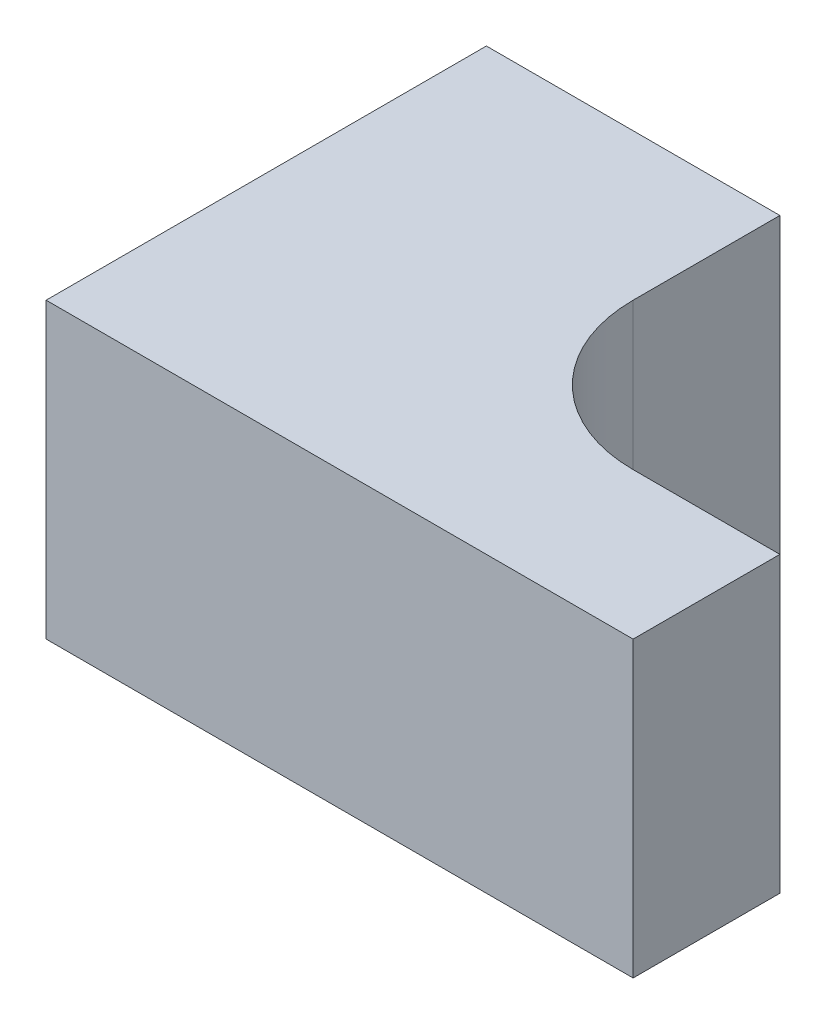
ISO-10303-21;
HEADER;
FILE_DESCRIPTION(('STEP AP214'),'2;1');
FILE_NAME('part.step','',(''),(''),'','','');
FILE_SCHEMA(('AUTOMOTIVE_DESIGN { 1 0 10303 214 1 1 1 1 }'));
ENDSEC;
DATA;
#1=APPLICATION_CONTEXT('core data for automotive mechanical design processes');
#2=APPLICATION_PROTOCOL_DEFINITION('international standard','automotive_design',2000,#1);
#3=PRODUCT_CONTEXT('',#1,'mechanical');
#4=PRODUCT('Part','Part','',(#3));
#5=PRODUCT_RELATED_PRODUCT_CATEGORY('part','',(#4));
#6=PRODUCT_DEFINITION_FORMATION('','',#4);
#7=PRODUCT_DEFINITION_CONTEXT('part definition',#1,'design');
#8=PRODUCT_DEFINITION('design','',#6,#7);
#9=PRODUCT_DEFINITION_SHAPE('','',#8);
#10=(LENGTH_UNIT() NAMED_UNIT(*) SI_UNIT(.MILLI.,.METRE.));
#11=(NAMED_UNIT(*) PLANE_ANGLE_UNIT() SI_UNIT($,.RADIAN.));
#12=(NAMED_UNIT(*) SI_UNIT($,.STERADIAN.) SOLID_ANGLE_UNIT());
#13=UNCERTAINTY_MEASURE_WITH_UNIT(LENGTH_MEASURE(1.E-05),#10,'distance_accuracy_value','');
#14=(GEOMETRIC_REPRESENTATION_CONTEXT(3) GLOBAL_UNCERTAINTY_ASSIGNED_CONTEXT((#13)) GLOBAL_UNIT_ASSIGNED_CONTEXT((#10,
#11,#12)) REPRESENTATION_CONTEXT('',''));
#15=CARTESIAN_POINT('',(0.,0.,0.));
#16=DIRECTION('',(0.,0.,1.));
#17=DIRECTION('',(1.,0.,0.));
#18=AXIS2_PLACEMENT_3D('',#15,#16,#17);
#19=CARTESIAN_POINT('',(-20.,20.,0.));
#20=DIRECTION('',(0.,0.,1.));
#21=DIRECTION('',(1.,0.,0.));
#22=AXIS2_PLACEMENT_3D('',#19,#20,#21);
#23=PLANE('',#22);
#24=DIRECTION('',(-1.,0.,0.));
#25=VECTOR('',#24,1.);
#26=CARTESIAN_POINT('',(-20.,0.,0.));
#27=LINE('',#26,#25);
#28=CARTESIAN_POINT('',(0.,0.,0.));
#29=VERTEX_POINT('',#28);
#30=CARTESIAN_POINT('',(-20.,0.,0.));
#31=VERTEX_POINT('',#30);
#32=EDGE_CURVE('E134',#29,#31,#27,.T.);
#33=ORIENTED_EDGE('',*,*,#32,.T.);
#34=DIRECTION('',(0.,-1.,0.));
#35=VECTOR('',#34,1.);
#36=CARTESIAN_POINT('',(-20.,20.,0.));
#37=LINE('',#36,#35);
#38=CARTESIAN_POINT('',(-20.,20.,0.));
#39=VERTEX_POINT('',#38);
#40=EDGE_CURVE('E11',#39,#31,#37,.T.);
#41=ORIENTED_EDGE('',*,*,#40,.F.);
#42=DIRECTION('',(-1.,0.,0.));
#43=VECTOR('',#42,1.);
#44=CARTESIAN_POINT('',(-20.,20.,0.));
#45=LINE('',#44,#43);
#46=CARTESIAN_POINT('',(0.,20.,0.));
#47=VERTEX_POINT('',#46);
#48=EDGE_CURVE('E153',#47,#39,#45,.T.);
#49=ORIENTED_EDGE('',*,*,#48,.F.);
#50=DIRECTION('',(0.,-1.,0.));
#51=VECTOR('',#50,1.);
#52=CARTESIAN_POINT('',(0.,20.,0.));
#53=LINE('',#52,#51);
#54=EDGE_CURVE('E130',#47,#29,#53,.T.);
#55=ORIENTED_EDGE('',*,*,#54,.T.);
#56=EDGE_LOOP('',(#33,#41,#49,#55));
#57=FACE_BOUND('',#56,.T.);
#58=ADVANCED_FACE('F39',(#57),#23,.F.);
#59=CARTESIAN_POINT('',(-20.,20.,30.));
#60=DIRECTION('',(1.,0.,0.));
#61=DIRECTION('',(0.,0.,-1.));
#62=AXIS2_PLACEMENT_3D('',#59,#60,#61);
#63=PLANE('',#62);
#64=DIRECTION('',(0.,0.,1.));
#65=VECTOR('',#64,1.);
#66=CARTESIAN_POINT('',(-20.,0.,30.));
#67=LINE('',#66,#65);
#68=CARTESIAN_POINT('',(-20.,0.,30.));
#69=VERTEX_POINT('',#68);
#70=EDGE_CURVE('E138',#31,#69,#67,.T.);
#71=ORIENTED_EDGE('',*,*,#70,.T.);
#72=DIRECTION('',(0.,-1.,0.));
#73=VECTOR('',#72,1.);
#74=CARTESIAN_POINT('',(-20.,20.,30.));
#75=LINE('',#74,#73);
#76=CARTESIAN_POINT('',(-20.,20.,30.));
#77=VERTEX_POINT('',#76);
#78=EDGE_CURVE('E48',#77,#69,#75,.T.);
#79=ORIENTED_EDGE('',*,*,#78,.F.);
#80=DIRECTION('',(0.,0.,1.));
#81=VECTOR('',#80,1.);
#82=CARTESIAN_POINT('',(-20.,20.,30.));
#83=LINE('',#82,#81);
#84=EDGE_CURVE('E96',#39,#77,#83,.T.);
#85=ORIENTED_EDGE('',*,*,#84,.F.);
#86=ORIENTED_EDGE('',*,*,#40,.T.);
#87=EDGE_LOOP('',(#71,#79,#85,#86));
#88=FACE_BOUND('',#87,.T.);
#89=ADVANCED_FACE('F187',(#88),#63,.F.);
#90=CARTESIAN_POINT('',(20.,20.,30.));
#91=DIRECTION('',(0.,0.,-1.));
#92=DIRECTION('',(-1.,0.,0.));
#93=AXIS2_PLACEMENT_3D('',#90,#91,#92);
#94=PLANE('',#93);
#95=DIRECTION('',(1.,0.,0.));
#96=VECTOR('',#95,1.);
#97=CARTESIAN_POINT('',(20.,0.,30.));
#98=LINE('',#97,#96);
#99=CARTESIAN_POINT('',(20.,0.,30.));
#100=VERTEX_POINT('',#99);
#101=EDGE_CURVE('E141',#69,#100,#98,.T.);
#102=ORIENTED_EDGE('',*,*,#101,.T.);
#103=DIRECTION('',(0.,-1.,0.));
#104=VECTOR('',#103,1.);
#105=CARTESIAN_POINT('',(20.,20.,30.));
#106=LINE('',#105,#104);
#107=CARTESIAN_POINT('',(20.,20.,30.));
#108=VERTEX_POINT('',#107);
#109=EDGE_CURVE('E160',#108,#100,#106,.T.);
#110=ORIENTED_EDGE('',*,*,#109,.F.);
#111=DIRECTION('',(1.,0.,0.));
#112=VECTOR('',#111,1.);
#113=CARTESIAN_POINT('',(20.,20.,30.));
#114=LINE('',#113,#112);
#115=EDGE_CURVE('E170',#77,#108,#114,.T.);
#116=ORIENTED_EDGE('',*,*,#115,.F.);
#117=ORIENTED_EDGE('',*,*,#78,.T.);
#118=EDGE_LOOP('',(#102,#110,#116,#117));
#119=FACE_BOUND('',#118,.T.);
#120=ADVANCED_FACE('F168',(#119),#94,.F.);
#121=CARTESIAN_POINT('',(20.,20.,20.));
#122=DIRECTION('',(-1.,0.,0.));
#123=DIRECTION('',(0.,0.,1.));
#124=AXIS2_PLACEMENT_3D('',#121,#122,#123);
#125=PLANE('',#124);
#126=DIRECTION('',(0.,0.,-1.));
#127=VECTOR('',#126,1.);
#128=CARTESIAN_POINT('',(20.,0.,20.));
#129=LINE('',#128,#127);
#130=CARTESIAN_POINT('',(20.,0.,20.));
#131=VERTEX_POINT('',#130);
#132=EDGE_CURVE('E144',#100,#131,#129,.T.);
#133=ORIENTED_EDGE('',*,*,#132,.T.);
#134=DIRECTION('',(0.,-1.,0.));
#135=VECTOR('',#134,1.);
#136=CARTESIAN_POINT('',(20.,20.,20.));
#137=LINE('',#136,#135);
#138=CARTESIAN_POINT('',(20.,20.,20.));
#139=VERTEX_POINT('',#138);
#140=EDGE_CURVE('E123',#139,#131,#137,.T.);
#141=ORIENTED_EDGE('',*,*,#140,.F.);
#142=DIRECTION('',(0.,0.,-1.));
#143=VECTOR('',#142,1.);
#144=CARTESIAN_POINT('',(20.,20.,20.));
#145=LINE('',#144,#143);
#146=EDGE_CURVE('E112',#108,#139,#145,.T.);
#147=ORIENTED_EDGE('',*,*,#146,.F.);
#148=ORIENTED_EDGE('',*,*,#109,.T.);
#149=EDGE_LOOP('',(#133,#141,#147,#148));
#150=FACE_BOUND('',#149,.T.);
#151=ADVANCED_FACE('F176',(#150),#125,.F.);
#152=CARTESIAN_POINT('',(10.,20.,20.));
#153=DIRECTION('',(0.,0.,1.));
#154=DIRECTION('',(1.,0.,0.));
#155=AXIS2_PLACEMENT_3D('',#152,#153,#154);
#156=PLANE('',#155);
#157=DIRECTION('',(-1.,0.,0.));
#158=VECTOR('',#157,1.);
#159=CARTESIAN_POINT('',(10.,0.,20.));
#160=LINE('',#159,#158);
#161=CARTESIAN_POINT('',(10.,0.,20.));
#162=VERTEX_POINT('',#161);
#163=EDGE_CURVE('E121',#131,#162,#160,.T.);
#164=ORIENTED_EDGE('',*,*,#163,.T.);
#165=DIRECTION('',(0.,-1.,0.));
#166=VECTOR('',#165,1.);
#167=CARTESIAN_POINT('',(10.,20.,20.));
#168=LINE('',#167,#166);
#169=CARTESIAN_POINT('',(10.,20.,20.));
#170=VERTEX_POINT('',#169);
#171=EDGE_CURVE('E118',#170,#162,#168,.T.);
#172=ORIENTED_EDGE('',*,*,#171,.F.);
#173=DIRECTION('',(-1.,0.,0.));
#174=VECTOR('',#173,1.);
#175=CARTESIAN_POINT('',(10.,20.,20.));
#176=LINE('',#175,#174);
#177=EDGE_CURVE('E106',#139,#170,#176,.T.);
#178=ORIENTED_EDGE('',*,*,#177,.F.);
#179=ORIENTED_EDGE('',*,*,#140,.T.);
#180=EDGE_LOOP('',(#164,#172,#178,#179));
#181=FACE_BOUND('',#180,.T.);
#182=ADVANCED_FACE('F119',(#181),#156,.F.);
#183=CARTESIAN_POINT('',(10.,20.,10.));
#184=DIRECTION('',(0.,-1.,0.));
#185=DIRECTION('',(0.,0.,-1.));
#186=AXIS2_PLACEMENT_3D('',#183,#184,#185);
#187=CYLINDRICAL_SURFACE('',#186,10.);
#188=CARTESIAN_POINT('',(10.,0.,10.));
#189=DIRECTION('',(0.,-1.,0.));
#190=DIRECTION('',(0.,0.,1.));
#191=AXIS2_PLACEMENT_3D('',#188,#189,#190);
#192=CIRCLE('',#191,10.);
#193=CARTESIAN_POINT('',(0.,0.,10.));
#194=VERTEX_POINT('',#193);
#195=EDGE_CURVE('E82',#162,#194,#192,.T.);
#196=ORIENTED_EDGE('',*,*,#195,.T.);
#197=DIRECTION('',(0.,-1.,0.));
#198=VECTOR('',#197,1.);
#199=CARTESIAN_POINT('',(0.,20.,10.));
#200=LINE('',#199,#198);
#201=CARTESIAN_POINT('',(0.,20.,10.));
#202=VERTEX_POINT('',#201);
#203=EDGE_CURVE('E124',#202,#194,#200,.T.);
#204=ORIENTED_EDGE('',*,*,#203,.F.);
#205=CARTESIAN_POINT('',(10.,20.,10.));
#206=DIRECTION('',(0.,-1.,0.));
#207=DIRECTION('',(0.,0.,1.));
#208=AXIS2_PLACEMENT_3D('',#205,#206,#207);
#209=CIRCLE('',#208,10.);
#210=EDGE_CURVE('E110',#170,#202,#209,.T.);
#211=ORIENTED_EDGE('',*,*,#210,.F.);
#212=ORIENTED_EDGE('',*,*,#171,.T.);
#213=EDGE_LOOP('',(#196,#204,#211,#212));
#214=FACE_BOUND('',#213,.T.);
#215=ADVANCED_FACE('F126',(#214),#187,.F.);
#216=CARTESIAN_POINT('',(0.,20.,0.));
#217=DIRECTION('',(-1.,0.,0.));
#218=DIRECTION('',(0.,0.,1.));
#219=AXIS2_PLACEMENT_3D('',#216,#217,#218);
#220=PLANE('',#219);
#221=DIRECTION('',(0.,0.,-1.));
#222=VECTOR('',#221,1.);
#223=CARTESIAN_POINT('',(0.,0.,0.));
#224=LINE('',#223,#222);
#225=EDGE_CURVE('E88',#194,#29,#224,.T.);
#226=ORIENTED_EDGE('',*,*,#225,.T.);
#227=ORIENTED_EDGE('',*,*,#54,.F.);
#228=DIRECTION('',(0.,0.,-1.));
#229=VECTOR('',#228,1.);
#230=CARTESIAN_POINT('',(0.,20.,0.));
#231=LINE('',#230,#229);
#232=EDGE_CURVE('E56',#202,#47,#231,.T.);
#233=ORIENTED_EDGE('',*,*,#232,.F.);
#234=ORIENTED_EDGE('',*,*,#203,.T.);
#235=EDGE_LOOP('',(#226,#227,#233,#234));
#236=FACE_BOUND('',#235,.T.);
#237=ADVANCED_FACE('F201',(#236),#220,.F.);
#238=CARTESIAN_POINT('',(10.,20.,10.));
#239=DIRECTION('',(0.,1.,0.));
#240=DIRECTION('',(0.,0.,1.));
#241=AXIS2_PLACEMENT_3D('',#238,#239,#240);
#242=PLANE('',#241);
#243=ORIENTED_EDGE('',*,*,#48,.T.);
#244=ORIENTED_EDGE('',*,*,#84,.T.);
#245=ORIENTED_EDGE('',*,*,#115,.T.);
#246=ORIENTED_EDGE('',*,*,#146,.T.);
#247=ORIENTED_EDGE('',*,*,#177,.T.);
#248=ORIENTED_EDGE('',*,*,#210,.T.);
#249=ORIENTED_EDGE('',*,*,#232,.T.);
#250=EDGE_LOOP('',(#243,#244,#245,#246,#247,#248,#249));
#251=FACE_BOUND('',#250,.T.);
#252=ADVANCED_FACE('F108',(#251),#242,.T.);
#253=CARTESIAN_POINT('',(10.,0.,10.));
#254=DIRECTION('',(0.,1.,0.));
#255=DIRECTION('',(0.,0.,1.));
#256=AXIS2_PLACEMENT_3D('',#253,#254,#255);
#257=PLANE('',#256);
#258=ORIENTED_EDGE('',*,*,#32,.F.);
#259=ORIENTED_EDGE('',*,*,#225,.F.);
#260=ORIENTED_EDGE('',*,*,#195,.F.);
#261=ORIENTED_EDGE('',*,*,#163,.F.);
#262=ORIENTED_EDGE('',*,*,#132,.F.);
#263=ORIENTED_EDGE('',*,*,#101,.F.);
#264=ORIENTED_EDGE('',*,*,#70,.F.);
#265=EDGE_LOOP('',(#258,#259,#260,#261,#262,#263,#264));
#266=FACE_BOUND('',#265,.T.);
#267=ADVANCED_FACE('F174',(#266),#257,.F.);
#268=CLOSED_SHELL('',(#58,#89,#120,#151,#182,#215,#237,#252,#267));
#269=MANIFOLD_SOLID_BREP('B2',#268);
#270=ADVANCED_BREP_SHAPE_REPRESENTATION('',(#18,#269),#14);
#271=SHAPE_DEFINITION_REPRESENTATION(#9,#270);
ENDSEC;
END-ISO-10303-21;
